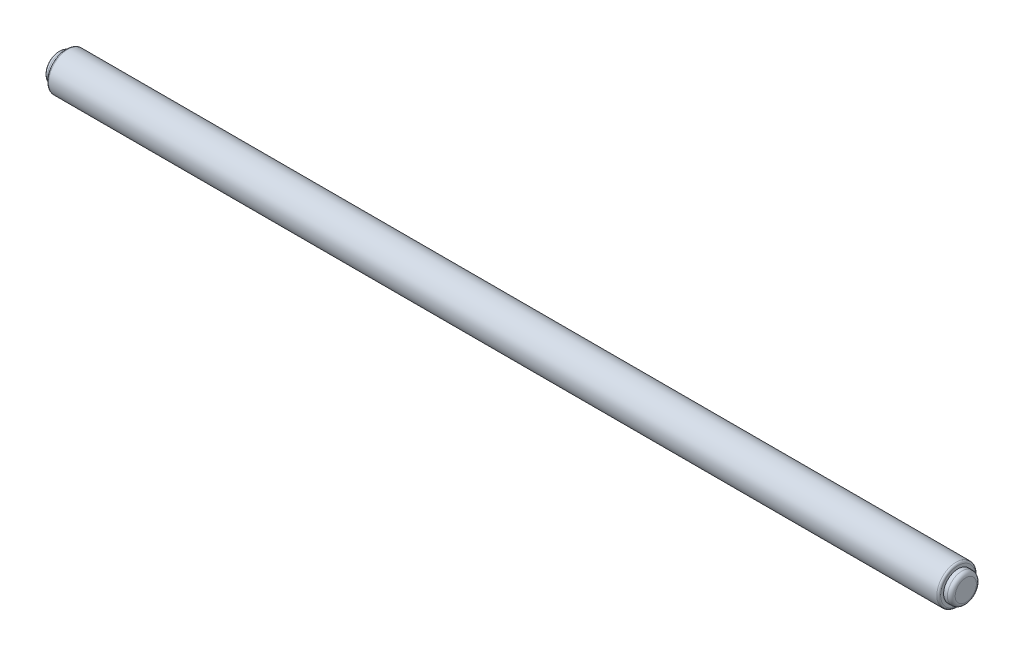
ISO-10303-21;
HEADER;
FILE_DESCRIPTION(('STEP AP214'),'2;1');
FILE_NAME('part.step','',(''),(''),'','','');
FILE_SCHEMA(('AUTOMOTIVE_DESIGN { 1 0 10303 214 1 1 1 1 }'));
ENDSEC;
DATA;
#1=APPLICATION_CONTEXT('core data for automotive mechanical design processes');
#2=APPLICATION_PROTOCOL_DEFINITION('international standard','automotive_design',2000,#1);
#3=PRODUCT_CONTEXT('',#1,'mechanical');
#4=PRODUCT('Part','Part','',(#3));
#5=PRODUCT_RELATED_PRODUCT_CATEGORY('part','',(#4));
#6=PRODUCT_DEFINITION_FORMATION('','',#4);
#7=PRODUCT_DEFINITION_CONTEXT('part definition',#1,'design');
#8=PRODUCT_DEFINITION('design','',#6,#7);
#9=PRODUCT_DEFINITION_SHAPE('','',#8);
#10=(LENGTH_UNIT() NAMED_UNIT(*) SI_UNIT(.MILLI.,.METRE.));
#11=(NAMED_UNIT(*) PLANE_ANGLE_UNIT() SI_UNIT($,.RADIAN.));
#12=(NAMED_UNIT(*) SI_UNIT($,.STERADIAN.) SOLID_ANGLE_UNIT());
#13=UNCERTAINTY_MEASURE_WITH_UNIT(LENGTH_MEASURE(1.E-05),#10,'distance_accuracy_value','');
#14=(GEOMETRIC_REPRESENTATION_CONTEXT(3) GLOBAL_UNCERTAINTY_ASSIGNED_CONTEXT((#13)) GLOBAL_UNIT_ASSIGNED_CONTEXT((#10,
#11,#12)) REPRESENTATION_CONTEXT('',''));
#15=CARTESIAN_POINT('',(0.,0.,0.));
#16=DIRECTION('',(0.,0.,1.));
#17=DIRECTION('',(1.,0.,0.));
#18=AXIS2_PLACEMENT_3D('',#15,#16,#17);
#19=CARTESIAN_POINT('',(-235.,0.,0.));
#20=DIRECTION('',(1.,0.,0.));
#21=DIRECTION('',(0.,1.,0.));
#22=AXIS2_PLACEMENT_3D('',#19,#20,#21);
#23=PLANE('',#22);
#24=CARTESIAN_POINT('',(-235.,0.,0.));
#25=DIRECTION('',(1.,0.,0.));
#26=DIRECTION('',(0.,1.,0.));
#27=AXIS2_PLACEMENT_3D('',#24,#25,#26);
#28=CIRCLE('',#27,5.5);
#29=CARTESIAN_POINT('',(-235.,5.50000000000003,0.));
#30=VERTEX_POINT('',#29);
#31=EDGE_CURVE('E39',#30,#30,#28,.F.);
#32=ORIENTED_EDGE('',*,*,#31,.T.);
#33=EDGE_LOOP('',(#32));
#34=FACE_BOUND('',#33,.T.);
#35=ADVANCED_FACE('F32',(#34),#23,.F.);
#36=CARTESIAN_POINT('',(-235.,0.,0.));
#37=DIRECTION('',(-1.,0.,0.));
#38=DIRECTION('',(0.,-1.,0.));
#39=AXIS2_PLACEMENT_3D('',#36,#37,#38);
#40=CYLINDRICAL_SURFACE('',#39,7.5);
#41=CARTESIAN_POINT('',(-233.,0.,0.));
#42=DIRECTION('',(1.,0.,0.));
#43=DIRECTION('',(0.,1.,0.));
#44=AXIS2_PLACEMENT_3D('',#41,#42,#43);
#45=CIRCLE('',#44,7.5);
#46=CARTESIAN_POINT('',(-233.,7.50000000000003,0.));
#47=VERTEX_POINT('',#46);
#48=EDGE_CURVE('E10',#47,#47,#45,.T.);
#49=ORIENTED_EDGE('',*,*,#48,.T.);
#50=EDGE_LOOP('',(#49));
#51=FACE_BOUND('',#50,.T.);
#52=CARTESIAN_POINT('',(-231.,0.,0.));
#53=DIRECTION('',(-1.,0.,0.));
#54=DIRECTION('',(0.,-1.,0.));
#55=AXIS2_PLACEMENT_3D('',#52,#53,#54);
#56=CIRCLE('',#55,7.5);
#57=CARTESIAN_POINT('',(-231.,-7.49999999999997,0.));
#58=VERTEX_POINT('',#57);
#59=EDGE_CURVE('E64',#58,#58,#56,.T.);
#60=ORIENTED_EDGE('',*,*,#59,.T.);
#61=EDGE_LOOP('',(#60));
#62=FACE_BOUND('',#61,.T.);
#63=ADVANCED_FACE('F89',(#51,#62),#40,.T.);
#64=CARTESIAN_POINT('',(-231.,7.50000000000001,0.));
#65=DIRECTION('',(1.,0.,0.));
#66=DIRECTION('',(0.,1.,0.));
#67=AXIS2_PLACEMENT_3D('',#64,#65,#66);
#68=PLANE('',#67);
#69=CARTESIAN_POINT('',(-231.,0.,0.));
#70=DIRECTION('',(1.,0.,0.));
#71=DIRECTION('',(0.,1.,0.));
#72=AXIS2_PLACEMENT_3D('',#69,#70,#71);
#73=CIRCLE('',#72,8.99999999999996);
#74=CARTESIAN_POINT('',(-231.,8.99999999999998,0.));
#75=VERTEX_POINT('',#74);
#76=EDGE_CURVE('E52',#75,#75,#73,.F.);
#77=ORIENTED_EDGE('',*,*,#76,.T.);
#78=EDGE_LOOP('',(#77));
#79=FACE_BOUND('',#78,.T.);
#80=ORIENTED_EDGE('',*,*,#59,.F.);
#81=EDGE_LOOP('',(#80));
#82=FACE_BOUND('',#81,.T.);
#83=ADVANCED_FACE('F94',(#79,#82),#68,.F.);
#84=CARTESIAN_POINT('',(-235.,0.,0.));
#85=DIRECTION('',(-1.,0.,0.));
#86=DIRECTION('',(0.,-1.,0.));
#87=AXIS2_PLACEMENT_3D('',#84,#85,#86);
#88=CYLINDRICAL_SURFACE('',#87,9.99999999999996);
#89=CARTESIAN_POINT('',(230.,1.2490009027033E-13,0.));
#90=DIRECTION('',(-1.,0.,0.));
#91=DIRECTION('',(0.,-1.,0.));
#92=AXIS2_PLACEMENT_3D('',#89,#90,#91);
#93=CIRCLE('',#92,9.99999999999996);
#94=CARTESIAN_POINT('',(230.,-9.99999999999983,0.));
#95=VERTEX_POINT('',#94);
#96=EDGE_CURVE('E58',#95,#95,#93,.T.);
#97=ORIENTED_EDGE('',*,*,#96,.T.);
#98=EDGE_LOOP('',(#97));
#99=FACE_BOUND('',#98,.T.);
#100=CARTESIAN_POINT('',(-230.,0.,0.));
#101=DIRECTION('',(1.,0.,0.));
#102=DIRECTION('',(0.,1.,0.));
#103=AXIS2_PLACEMENT_3D('',#100,#101,#102);
#104=CIRCLE('',#103,9.99999999999996);
#105=CARTESIAN_POINT('',(-230.,9.99999999999998,0.));
#106=VERTEX_POINT('',#105);
#107=EDGE_CURVE('E61',#106,#106,#104,.T.);
#108=ORIENTED_EDGE('',*,*,#107,.T.);
#109=EDGE_LOOP('',(#108));
#110=FACE_BOUND('',#109,.T.);
#111=ADVANCED_FACE('F85',(#99,#110),#88,.T.);
#112=CARTESIAN_POINT('',(231.,10.,0.));
#113=DIRECTION('',(-1.,0.,0.));
#114=DIRECTION('',(0.,-1.,0.));
#115=AXIS2_PLACEMENT_3D('',#112,#113,#114);
#116=PLANE('',#115);
#117=CARTESIAN_POINT('',(231.,1.2490009027033E-13,0.));
#118=DIRECTION('',(-1.,0.,0.));
#119=DIRECTION('',(0.,-1.,0.));
#120=AXIS2_PLACEMENT_3D('',#117,#118,#119);
#121=CIRCLE('',#120,8.99999999999996);
#122=CARTESIAN_POINT('',(231.,-8.99999999999983,0.));
#123=VERTEX_POINT('',#122);
#124=EDGE_CURVE('E55',#123,#123,#121,.F.);
#125=ORIENTED_EDGE('',*,*,#124,.T.);
#126=EDGE_LOOP('',(#125));
#127=FACE_BOUND('',#126,.T.);
#128=CARTESIAN_POINT('',(231.,1.2490009027033E-13,0.));
#129=DIRECTION('',(-1.,0.,0.));
#130=DIRECTION('',(0.,-1.,0.));
#131=AXIS2_PLACEMENT_3D('',#128,#129,#130);
#132=CIRCLE('',#131,7.49999999999991);
#133=CARTESIAN_POINT('',(231.,-7.49999999999979,0.));
#134=VERTEX_POINT('',#133);
#135=EDGE_CURVE('E67',#134,#134,#132,.T.);
#136=ORIENTED_EDGE('',*,*,#135,.T.);
#137=EDGE_LOOP('',(#136));
#138=FACE_BOUND('',#137,.T.);
#139=ADVANCED_FACE('F71',(#127,#138),#116,.F.);
#140=CARTESIAN_POINT('',(-235.,0.,0.));
#141=DIRECTION('',(-1.,0.,0.));
#142=DIRECTION('',(0.,-1.,0.));
#143=AXIS2_PLACEMENT_3D('',#140,#141,#142);
#144=CYLINDRICAL_SURFACE('',#143,7.49999999999996);
#145=CARTESIAN_POINT('',(233.,1.2490009027033E-13,0.));
#146=DIRECTION('',(-1.,0.,0.));
#147=DIRECTION('',(0.,-1.,0.));
#148=AXIS2_PLACEMENT_3D('',#145,#146,#147);
#149=CIRCLE('',#148,7.49999999999996);
#150=CARTESIAN_POINT('',(233.,-7.49999999999983,0.));
#151=VERTEX_POINT('',#150);
#152=EDGE_CURVE('E47',#151,#151,#149,.T.);
#153=ORIENTED_EDGE('',*,*,#152,.T.);
#154=EDGE_LOOP('',(#153));
#155=FACE_BOUND('',#154,.T.);
#156=ORIENTED_EDGE('',*,*,#135,.F.);
#157=EDGE_LOOP('',(#156));
#158=FACE_BOUND('',#157,.T.);
#159=ADVANCED_FACE('F73',(#155,#158),#144,.T.);
#160=CARTESIAN_POINT('',(235.,7.50000000000012,0.));
#161=DIRECTION('',(-1.,0.,0.));
#162=DIRECTION('',(0.,-1.,0.));
#163=AXIS2_PLACEMENT_3D('',#160,#161,#162);
#164=PLANE('',#163);
#165=CARTESIAN_POINT('',(235.,1.2490009027033E-13,0.));
#166=DIRECTION('',(-1.,0.,0.));
#167=DIRECTION('',(0.,-1.,0.));
#168=AXIS2_PLACEMENT_3D('',#165,#166,#167);
#169=CIRCLE('',#168,5.49999999999996);
#170=CARTESIAN_POINT('',(235.,-5.49999999999983,0.));
#171=VERTEX_POINT('',#170);
#172=EDGE_CURVE('E43',#171,#171,#169,.F.);
#173=ORIENTED_EDGE('',*,*,#172,.T.);
#174=EDGE_LOOP('',(#173));
#175=FACE_BOUND('',#174,.T.);
#176=ADVANCED_FACE('F75',(#175),#164,.F.);
#177=CARTESIAN_POINT('',(230.,1.2490009027033E-13,0.));
#178=DIRECTION('',(-1.,0.,0.));
#179=DIRECTION('',(0.,-1.,0.));
#180=AXIS2_PLACEMENT_3D('',#177,#178,#179);
#181=TOROIDAL_SURFACE('',#180,8.99999999999996,1.);
#182=ORIENTED_EDGE('',*,*,#124,.F.);
#183=EDGE_LOOP('',(#182));
#184=FACE_BOUND('',#183,.T.);
#185=ORIENTED_EDGE('',*,*,#96,.F.);
#186=EDGE_LOOP('',(#185));
#187=FACE_BOUND('',#186,.T.);
#188=ADVANCED_FACE('F82',(#184,#187),#181,.T.);
#189=CARTESIAN_POINT('',(-230.,0.,0.));
#190=DIRECTION('',(1.,0.,0.));
#191=DIRECTION('',(0.,1.,0.));
#192=AXIS2_PLACEMENT_3D('',#189,#190,#191);
#193=TOROIDAL_SURFACE('',#192,8.99999999999996,1.);
#194=ORIENTED_EDGE('',*,*,#107,.F.);
#195=EDGE_LOOP('',(#194));
#196=FACE_BOUND('',#195,.T.);
#197=ORIENTED_EDGE('',*,*,#76,.F.);
#198=EDGE_LOOP('',(#197));
#199=FACE_BOUND('',#198,.T.);
#200=ADVANCED_FACE('F100',(#196,#199),#193,.T.);
#201=CARTESIAN_POINT('',(233.,1.2490009027033E-13,0.));
#202=DIRECTION('',(-1.,0.,0.));
#203=DIRECTION('',(0.,-1.,0.));
#204=AXIS2_PLACEMENT_3D('',#201,#202,#203);
#205=TOROIDAL_SURFACE('',#204,5.49999999999996,2.);
#206=ORIENTED_EDGE('',*,*,#172,.F.);
#207=EDGE_LOOP('',(#206));
#208=FACE_BOUND('',#207,.T.);
#209=ORIENTED_EDGE('',*,*,#152,.F.);
#210=EDGE_LOOP('',(#209));
#211=FACE_BOUND('',#210,.T.);
#212=ADVANCED_FACE('F103',(#208,#211),#205,.T.);
#213=CARTESIAN_POINT('',(-233.,0.,0.));
#214=DIRECTION('',(1.,0.,0.));
#215=DIRECTION('',(0.,1.,0.));
#216=AXIS2_PLACEMENT_3D('',#213,#214,#215);
#217=TOROIDAL_SURFACE('',#216,5.5,2.);
#218=ORIENTED_EDGE('',*,*,#48,.F.);
#219=EDGE_LOOP('',(#218));
#220=FACE_BOUND('',#219,.T.);
#221=ORIENTED_EDGE('',*,*,#31,.F.);
#222=EDGE_LOOP('',(#221));
#223=FACE_BOUND('',#222,.T.);
#224=ADVANCED_FACE('F34',(#220,#223),#217,.T.);
#225=CLOSED_SHELL('',(#35,#63,#83,#111,#139,#159,#176,#188,#200,#212,#224));
#226=MANIFOLD_SOLID_BREP('B2',#225);
#227=ADVANCED_BREP_SHAPE_REPRESENTATION('',(#18,#226),#14);
#228=SHAPE_DEFINITION_REPRESENTATION(#9,#227);
ENDSEC;
END-ISO-10303-21;
